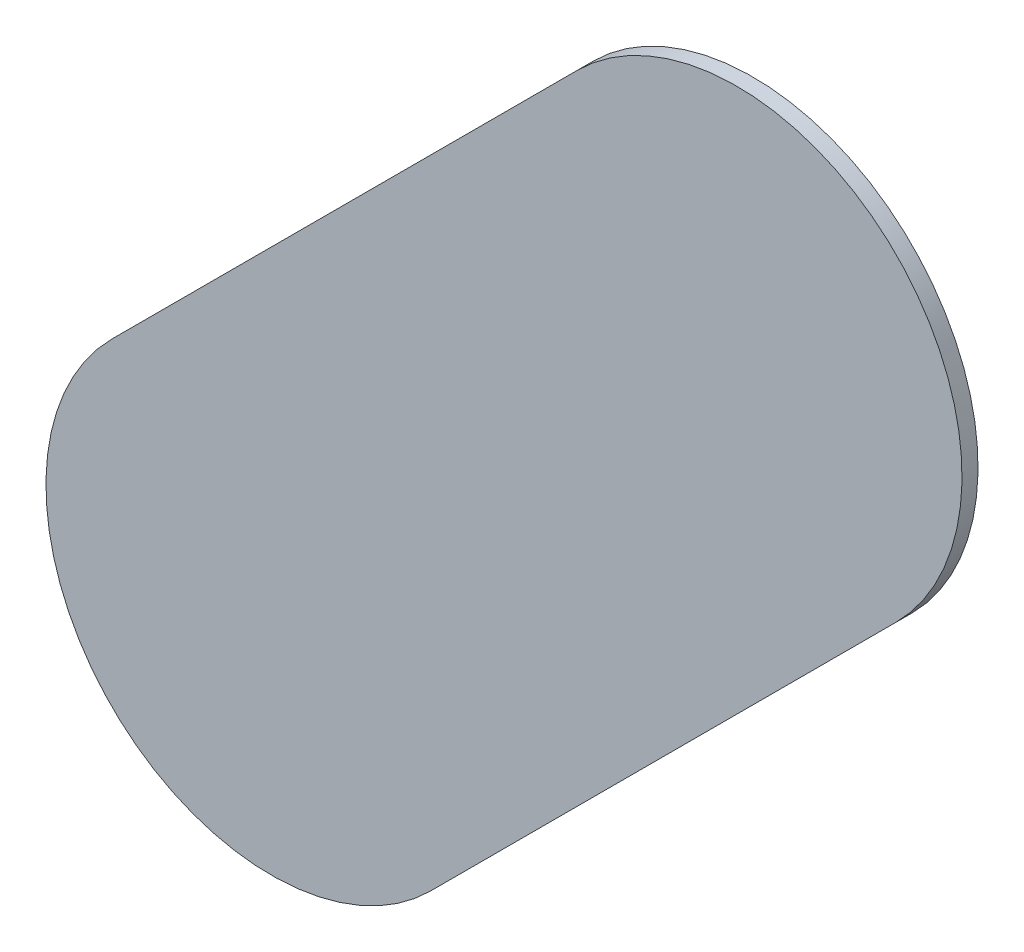
ISO-10303-21;
HEADER;
FILE_DESCRIPTION(('STEP AP214'),'2;1');
FILE_NAME('part.step','',(''),(''),'','','');
FILE_SCHEMA(('AUTOMOTIVE_DESIGN { 1 0 10303 214 1 1 1 1 }'));
ENDSEC;
DATA;
#1=APPLICATION_CONTEXT('core data for automotive mechanical design processes');
#2=APPLICATION_PROTOCOL_DEFINITION('international standard','automotive_design',2000,#1);
#3=PRODUCT_CONTEXT('',#1,'mechanical');
#4=PRODUCT('Part','Part','',(#3));
#5=PRODUCT_RELATED_PRODUCT_CATEGORY('part','',(#4));
#6=PRODUCT_DEFINITION_FORMATION('','',#4);
#7=PRODUCT_DEFINITION_CONTEXT('part definition',#1,'design');
#8=PRODUCT_DEFINITION('design','',#6,#7);
#9=PRODUCT_DEFINITION_SHAPE('','',#8);
#10=(LENGTH_UNIT() NAMED_UNIT(*) SI_UNIT(.MILLI.,.METRE.));
#11=(NAMED_UNIT(*) PLANE_ANGLE_UNIT() SI_UNIT($,.RADIAN.));
#12=(NAMED_UNIT(*) SI_UNIT($,.STERADIAN.) SOLID_ANGLE_UNIT());
#13=UNCERTAINTY_MEASURE_WITH_UNIT(LENGTH_MEASURE(1.E-05),#10,'distance_accuracy_value','');
#14=(GEOMETRIC_REPRESENTATION_CONTEXT(3) GLOBAL_UNCERTAINTY_ASSIGNED_CONTEXT((#13)) GLOBAL_UNIT_ASSIGNED_CONTEXT((#10,
#11,#12)) REPRESENTATION_CONTEXT('',''));
#15=CARTESIAN_POINT('',(0.,0.,0.));
#16=DIRECTION('',(0.,0.,1.));
#17=DIRECTION('',(1.,0.,0.));
#18=AXIS2_PLACEMENT_3D('',#15,#16,#17);
#19=CARTESIAN_POINT('',(55.89984756,60.14644816,0.));
#20=DIRECTION('',(-0.70710678118655,0.707106781186545,0.));
#21=DIRECTION('',(0.707106781186545,0.70710678118655,0.));
#22=AXIS2_PLACEMENT_3D('',#19,#20,#21);
#23=PLANE('',#22);
#24=DIRECTION('',(0.707106781186545,0.70710678118655,0.));
#25=VECTOR('',#24,1.);
#26=CARTESIAN_POINT('',(55.89984756,60.14644816,0.03556));
#27=LINE('',#26,#25);
#28=CARTESIAN_POINT('',(55.89984756,60.14644816,0.03556));
#29=VERTEX_POINT('',#28);
#30=CARTESIAN_POINT('',(56.93250996,61.17911056,0.03556));
#31=VERTEX_POINT('',#30);
#32=EDGE_CURVE('E11',#29,#31,#27,.T.);
#33=ORIENTED_EDGE('',*,*,#32,.F.);
#34=DIRECTION('',(0.,0.,1.));
#35=VECTOR('',#34,1.);
#36=CARTESIAN_POINT('',(55.89984756,60.14644816,0.));
#37=LINE('',#36,#35);
#38=CARTESIAN_POINT('',(55.89984756,60.14644816,0.));
#39=VERTEX_POINT('',#38);
#40=EDGE_CURVE('E24',#39,#29,#37,.T.);
#41=ORIENTED_EDGE('',*,*,#40,.F.);
#42=DIRECTION('',(0.707106781186545,0.70710678118655,0.));
#43=VECTOR('',#42,1.);
#44=CARTESIAN_POINT('',(55.89984756,60.14644816,0.));
#45=LINE('',#44,#43);
#46=CARTESIAN_POINT('',(56.93250996,61.17911056,0.));
#47=VERTEX_POINT('',#46);
#48=EDGE_CURVE('E75',#39,#47,#45,.T.);
#49=ORIENTED_EDGE('',*,*,#48,.T.);
#50=DIRECTION('',(0.,0.,1.));
#51=VECTOR('',#50,1.);
#52=CARTESIAN_POINT('',(56.93250996,61.17911056,0.));
#53=LINE('',#52,#51);
#54=EDGE_CURVE('E37',#47,#31,#53,.T.);
#55=ORIENTED_EDGE('',*,*,#54,.T.);
#56=EDGE_LOOP('',(#33,#41,#49,#55));
#57=FACE_BOUND('',#56,.T.);
#58=ADVANCED_FACE('F17',(#57),#23,.F.);
#59=CARTESIAN_POINT('',(56.5789572,61.53266332,0.));
#60=DIRECTION('',(0.,0.,-1.));
#61=DIRECTION('',(0.707106781186548,-0.707106781186548,0.));
#62=AXIS2_PLACEMENT_3D('',#59,#60,#61);
#63=CYLINDRICAL_SURFACE('',#62,0.499999108206439);
#64=CARTESIAN_POINT('',(56.5789572,61.53266332,0.03556));
#65=DIRECTION('',(0.,0.,1.));
#66=DIRECTION('',(0.707106781186548,-0.707106781186548,0.));
#67=AXIS2_PLACEMENT_3D('',#64,#65,#66);
#68=CIRCLE('',#67,0.499999108206439);
#69=CARTESIAN_POINT('',(56.22540444,61.88621608,0.03556));
#70=VERTEX_POINT('',#69);
#71=EDGE_CURVE('E83',#31,#70,#68,.T.);
#72=ORIENTED_EDGE('',*,*,#71,.F.);
#73=ORIENTED_EDGE('',*,*,#54,.F.);
#74=CARTESIAN_POINT('',(56.5789572,61.53266332,0.));
#75=DIRECTION('',(0.,0.,1.));
#76=DIRECTION('',(0.707106781186548,-0.707106781186548,0.));
#77=AXIS2_PLACEMENT_3D('',#74,#75,#76);
#78=CIRCLE('',#77,0.499999108206439);
#79=CARTESIAN_POINT('',(56.22540444,61.88621608,0.));
#80=VERTEX_POINT('',#79);
#81=EDGE_CURVE('E81',#47,#80,#78,.T.);
#82=ORIENTED_EDGE('',*,*,#81,.T.);
#83=DIRECTION('',(0.,0.,1.));
#84=VECTOR('',#83,1.);
#85=CARTESIAN_POINT('',(56.22540444,61.88621608,0.));
#86=LINE('',#85,#84);
#87=EDGE_CURVE('E67',#80,#70,#86,.T.);
#88=ORIENTED_EDGE('',*,*,#87,.T.);
#89=EDGE_LOOP('',(#72,#73,#82,#88));
#90=FACE_BOUND('',#89,.T.);
#91=ADVANCED_FACE('F89',(#90),#63,.T.);
#92=CARTESIAN_POINT('',(56.22540444,61.88621608,0.));
#93=DIRECTION('',(0.707106781186545,-0.70710678118655,0.));
#94=DIRECTION('',(-0.70710678118655,-0.707106781186545,0.));
#95=AXIS2_PLACEMENT_3D('',#92,#93,#94);
#96=PLANE('',#95);
#97=DIRECTION('',(-0.70710678118655,-0.707106781186545,0.));
#98=VECTOR('',#97,1.);
#99=CARTESIAN_POINT('',(56.22540444,61.88621608,0.03556));
#100=LINE('',#99,#98);
#101=CARTESIAN_POINT('',(55.19274204,60.85355368,0.03556));
#102=VERTEX_POINT('',#101);
#103=EDGE_CURVE('E71',#70,#102,#100,.T.);
#104=ORIENTED_EDGE('',*,*,#103,.F.);
#105=ORIENTED_EDGE('',*,*,#87,.F.);
#106=DIRECTION('',(-0.70710678118655,-0.707106781186545,0.));
#107=VECTOR('',#106,1.);
#108=CARTESIAN_POINT('',(56.22540444,61.88621608,0.));
#109=LINE('',#108,#107);
#110=CARTESIAN_POINT('',(55.19274204,60.85355368,0.));
#111=VERTEX_POINT('',#110);
#112=EDGE_CURVE('E63',#80,#111,#109,.T.);
#113=ORIENTED_EDGE('',*,*,#112,.T.);
#114=DIRECTION('',(0.,0.,1.));
#115=VECTOR('',#114,1.);
#116=CARTESIAN_POINT('',(55.19274204,60.85355368,0.));
#117=LINE('',#116,#115);
#118=EDGE_CURVE('E53',#111,#102,#117,.T.);
#119=ORIENTED_EDGE('',*,*,#118,.T.);
#120=EDGE_LOOP('',(#104,#105,#113,#119));
#121=FACE_BOUND('',#120,.T.);
#122=ADVANCED_FACE('F66',(#121),#96,.F.);
#123=CARTESIAN_POINT('',(55.5462948,60.50000092,0.));
#124=DIRECTION('',(0.,0.,-1.));
#125=DIRECTION('',(-0.707106781186548,0.707106781186548,0.));
#126=AXIS2_PLACEMENT_3D('',#123,#124,#125);
#127=CYLINDRICAL_SURFACE('',#126,0.499999108206444);
#128=CARTESIAN_POINT('',(55.5462948,60.50000092,0.03556));
#129=DIRECTION('',(0.,0.,1.));
#130=DIRECTION('',(-0.707106781186548,0.707106781186548,0.));
#131=AXIS2_PLACEMENT_3D('',#128,#129,#130);
#132=CIRCLE('',#131,0.499999108206444);
#133=EDGE_CURVE('E59',#102,#29,#132,.T.);
#134=ORIENTED_EDGE('',*,*,#133,.F.);
#135=ORIENTED_EDGE('',*,*,#118,.F.);
#136=CARTESIAN_POINT('',(55.5462948,60.50000092,0.));
#137=DIRECTION('',(0.,0.,1.));
#138=DIRECTION('',(-0.707106781186548,0.707106781186548,0.));
#139=AXIS2_PLACEMENT_3D('',#136,#137,#138);
#140=CIRCLE('',#139,0.499999108206444);
#141=EDGE_CURVE('E57',#111,#39,#140,.T.);
#142=ORIENTED_EDGE('',*,*,#141,.T.);
#143=ORIENTED_EDGE('',*,*,#40,.T.);
#144=EDGE_LOOP('',(#134,#135,#142,#143));
#145=FACE_BOUND('',#144,.T.);
#146=ADVANCED_FACE('F55',(#145),#127,.T.);
#147=CARTESIAN_POINT('',(55.89984756,60.14644816,0.));
#148=DIRECTION('',(0.,0.,-1.));
#149=DIRECTION('',(-1.,0.,0.));
#150=AXIS2_PLACEMENT_3D('',#147,#148,#149);
#151=PLANE('',#150);
#152=ORIENTED_EDGE('',*,*,#141,.F.);
#153=ORIENTED_EDGE('',*,*,#112,.F.);
#154=ORIENTED_EDGE('',*,*,#81,.F.);
#155=ORIENTED_EDGE('',*,*,#48,.F.);
#156=EDGE_LOOP('',(#152,#153,#154,#155));
#157=FACE_BOUND('',#156,.T.);
#158=ADVANCED_FACE('F74',(#157),#151,.T.);
#159=CARTESIAN_POINT('',(55.89984756,60.14644816,0.03556));
#160=DIRECTION('',(0.,0.,-1.));
#161=DIRECTION('',(-1.,0.,0.));
#162=AXIS2_PLACEMENT_3D('',#159,#160,#161);
#163=PLANE('',#162);
#164=ORIENTED_EDGE('',*,*,#32,.T.);
#165=ORIENTED_EDGE('',*,*,#71,.T.);
#166=ORIENTED_EDGE('',*,*,#103,.T.);
#167=ORIENTED_EDGE('',*,*,#133,.T.);
#168=EDGE_LOOP('',(#164,#165,#166,#167));
#169=FACE_BOUND('',#168,.T.);
#170=ADVANCED_FACE('F91',(#169),#163,.F.);
#171=CLOSED_SHELL('',(#58,#91,#122,#146,#158,#170));
#172=MANIFOLD_SOLID_BREP('B1',#171);
#173=ADVANCED_BREP_SHAPE_REPRESENTATION('',(#18,#172),#14);
#174=SHAPE_DEFINITION_REPRESENTATION(#9,#173);
ENDSEC;
END-ISO-10303-21;
